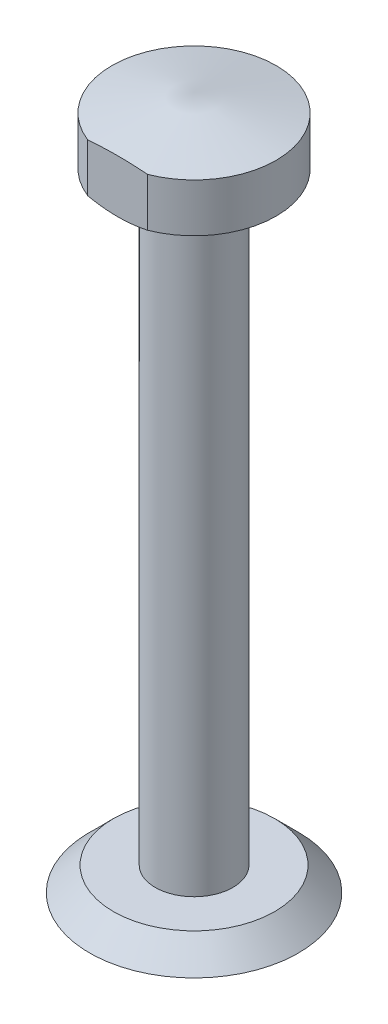
ISO-10303-21;
HEADER;
FILE_DESCRIPTION(('STEP AP214'),'2;1');
FILE_NAME('part.step','',(''),(''),'','','');
FILE_SCHEMA(('AUTOMOTIVE_DESIGN { 1 0 10303 214 1 1 1 1 }'));
ENDSEC;
DATA;
#1=APPLICATION_CONTEXT('core data for automotive mechanical design processes');
#2=APPLICATION_PROTOCOL_DEFINITION('international standard','automotive_design',2000,#1);
#3=PRODUCT_CONTEXT('',#1,'mechanical');
#4=PRODUCT('Part','Part','',(#3));
#5=PRODUCT_RELATED_PRODUCT_CATEGORY('part','',(#4));
#6=PRODUCT_DEFINITION_FORMATION('','',#4);
#7=PRODUCT_DEFINITION_CONTEXT('part definition',#1,'design');
#8=PRODUCT_DEFINITION('design','',#6,#7);
#9=PRODUCT_DEFINITION_SHAPE('','',#8);
#10=(LENGTH_UNIT() NAMED_UNIT(*) SI_UNIT(.MILLI.,.METRE.));
#11=(NAMED_UNIT(*) PLANE_ANGLE_UNIT() SI_UNIT($,.RADIAN.));
#12=(NAMED_UNIT(*) SI_UNIT($,.STERADIAN.) SOLID_ANGLE_UNIT());
#13=UNCERTAINTY_MEASURE_WITH_UNIT(LENGTH_MEASURE(1.E-05),#10,'distance_accuracy_value','');
#14=(GEOMETRIC_REPRESENTATION_CONTEXT(3) GLOBAL_UNCERTAINTY_ASSIGNED_CONTEXT((#13)) GLOBAL_UNIT_ASSIGNED_CONTEXT((#10,
#11,#12)) REPRESENTATION_CONTEXT('',''));
#15=CARTESIAN_POINT('',(0.,0.,0.));
#16=DIRECTION('',(0.,0.,1.));
#17=DIRECTION('',(1.,0.,0.));
#18=AXIS2_PLACEMENT_3D('',#15,#16,#17);
#19=CARTESIAN_POINT('',(1.27,0.,3.25340686819215));
#20=DIRECTION('',(0.,0.,-1.));
#21=DIRECTION('',(-1.,0.,0.));
#22=AXIS2_PLACEMENT_3D('',#19,#20,#21);
#23=PLANE('',#22);
#24=CARTESIAN_POINT('',(-4.89882967706772,2.16426954046307,3.25340686819215));
#25=CARTESIAN_POINT('',(-4.7519167099686,2.1909643249345,3.25340686819215));
#26=CARTESIAN_POINT('',(-4.60494045734861,2.21731638959515,3.25340686819215));
#27=CARTESIAN_POINT('',(-4.31083071006533,2.26915356575494,3.25340686819215));
#28=CARTESIAN_POINT('',(-4.16369721074294,2.2946386507878,3.25340686819215));
#29=CARTESIAN_POINT('',(-3.86914996000027,2.34457587740771,3.25340686819215));
#30=CARTESIAN_POINT('',(-3.72173608540707,2.36902729620814,3.25340686819215));
#31=CARTESIAN_POINT('',(-3.42669963324869,2.41662931044595,3.25340686819215));
#32=CARTESIAN_POINT('',(-3.27907705694821,2.43977991373171,3.25340686819215));
#33=CARTESIAN_POINT('',(-2.83747630753173,2.50660654161038,3.25340686819215));
#34=CARTESIAN_POINT('',(-2.5431362347157,2.54793967043783,3.25340686819215));
#35=CARTESIAN_POINT('',(-1.95326037521305,2.6210895173789,3.25340686819215));
#36=CARTESIAN_POINT('',(-1.65772476156763,2.65290756602949,3.25340686819215));
#37=CARTESIAN_POINT('',(-1.21246256748333,2.69041024332625,3.25340686819215));
#38=CARTESIAN_POINT('',(-1.06316946941012,2.70122751819436,3.25340686819215));
#39=CARTESIAN_POINT('',(-0.764350039500438,2.71885576342233,3.25340686819215));
#40=CARTESIAN_POINT('',(-0.614823720782832,2.72566695151872,3.25340686819215));
#41=CARTESIAN_POINT('',(-0.315670450385112,2.73490538670405,3.25340686819215));
#42=CARTESIAN_POINT('',(-0.16604353290255,2.73733372169666,3.25340686819215));
#43=CARTESIAN_POINT('',(0.133215448923475,2.73766310304199,3.25340686819215));
#44=CARTESIAN_POINT('',(0.282847513269546,2.73556414706589,3.25340686819215));
#45=CARTESIAN_POINT('',(0.582365533255247,2.72695508890956,3.25340686819215));
#46=CARTESIAN_POINT('',(0.732251159353576,2.72043371762748,3.25340686819215));
#47=CARTESIAN_POINT('',(1.03179396271561,2.70333388919217,3.25340686819215));
#48=CARTESIAN_POINT('',(1.18145112693377,2.69275520846436,3.25340686819215));
#49=CARTESIAN_POINT('',(1.63008058208111,2.65569636163098,3.25340686819215));
#50=CARTESIAN_POINT('',(1.92861268722816,2.6238968322093,3.25340686819215));
#51=CARTESIAN_POINT('',(2.51952796820642,2.55109613340072,3.25340686819215));
#52=CARTESIAN_POINT('',(2.81193178096016,2.51025417667557,3.25340686819215));
#53=CARTESIAN_POINT('',(3.39581238317383,2.42231202644766,3.25340686819215));
#54=CARTESIAN_POINT('',(3.68728907935283,2.37521122241516,3.25340686819215));
#55=CARTESIAN_POINT('',(4.26959140133661,2.27685835974507,3.25340686819215));
#56=CARTESIAN_POINT('',(4.56041688640625,2.22560547887022,3.25340686819215));
#57=CARTESIAN_POINT('',(5.14156147333174,2.12029761523514,3.25340686819215));
#58=CARTESIAN_POINT('',(5.43188056761253,2.06624259092322,3.25340686819215));
#59=CARTESIAN_POINT('',(6.00999849172882,1.95659096656105,3.25340686819215));
#60=CARTESIAN_POINT('',(6.29780006184337,1.90100874976937,3.25340686819215));
#61=CARTESIAN_POINT('',(6.87313668159848,1.78846412798365,3.25340686819215));
#62=CARTESIAN_POINT('',(7.16067172749545,1.73150170389937,3.25340686819215));
#63=CARTESIAN_POINT('',(7.73527000366069,1.6166181988133,3.25340686819215));
#64=CARTESIAN_POINT('',(8.02233342365946,1.55869806470801,3.25340686819215));
#65=CARTESIAN_POINT('',(8.5962956157036,1.44208185724197,3.25340686819215));
#66=CARTESIAN_POINT('',(8.8831943915008,1.3833858023598,3.25340686819215));
#67=CARTESIAN_POINT('',(9.17003658488438,1.32441770074967,3.25340686819215));
#68=B_SPLINE_CURVE_WITH_KNOTS('',3,(#24,#25,#26,#27,#28,#29,#30,#31,#32,#33,#34,#35,#36,#37,#38,
#39,#40,#41,#42,#43,#44,#45,#46,#47,#48,#49,#50,#51,#52,#53,#54,#55,#56,#57,#58,#59,#60,#61,#62,
#63,#64,#65,#66,#67),.UNSPECIFIED.,.F.,.F.,(4,2,2,2,2,2,2,2,2,2,2,2,2,2,2,2,2,2,2,2,2,4),(0.,
0.447956687269475,0.895927037059361,1.34420561490563,1.79248148780424,2.68407463007321,
3.5755430384531,4.02455127842692,4.47353511190559,4.92240748411371,5.3712800872202,
5.82130081709647,6.27134634854511,7.17173169563352,8.05737243613143,8.94309963144319,
9.82900265841436,10.7149188257964,11.5942733331645,12.4736400102154,13.3521838567276,
14.2307068182374),.UNSPECIFIED.);
#69=CARTESIAN_POINT('',(-1.27000000000001,2.68534167212368,3.25340686819215));
#70=VERTEX_POINT('',#69);
#71=CARTESIAN_POINT('',(1.27000000000001,2.68534167212368,3.25340686819215));
#72=VERTEX_POINT('',#71);
#73=EDGE_CURVE('E11',#70,#72,#68,.T.);
#74=ORIENTED_EDGE('',*,*,#73,.F.);
#75=DIRECTION('',(0.,1.,0.));
#76=VECTOR('',#75,1.);
#77=CARTESIAN_POINT('',(-1.27000000000001,0.,3.25340686819215));
#78=LINE('',#77,#76);
#79=CARTESIAN_POINT('',(-1.27000000000001,0.62794167212368,3.25340686819215));
#80=VERTEX_POINT('',#79);
#81=EDGE_CURVE('E76',#80,#70,#78,.T.);
#82=ORIENTED_EDGE('',*,*,#81,.F.);
#83=CARTESIAN_POINT('',(1.27000000000001,0.627941672123679,3.25340686819215));
#84=CARTESIAN_POINT('',(1.19185442410433,0.611531398834376,3.25340686819215));
#85=CARTESIAN_POINT('',(1.11343527376145,0.596385289302159,3.25340686819215));
#86=CARTESIAN_POINT('',(0.956094642560905,0.568853854683344,3.25340686819215));
#87=CARTESIAN_POINT('',(0.877173039336211,0.556469230821725,3.25340686819215));
#88=CARTESIAN_POINT('',(0.718865878140397,0.53469544117384,3.25340686819215));
#89=CARTESIAN_POINT('',(0.639480076427389,0.525308026603405,3.25340686819215));
#90=CARTESIAN_POINT('',(0.480406175495382,0.5097285199006,3.25340686819215));
#91=CARTESIAN_POINT('',(0.400718104909803,0.503536132365295,3.25340686819215));
#92=CARTESIAN_POINT('',(0.164002693533581,0.490131479381196,3.25340686819215));
#93=CARTESIAN_POINT('',(0.0066737311917493,0.487719145714795,3.25340686819215));
#94=CARTESIAN_POINT('',(-0.307527045773426,0.496096688800075,3.25340686819215));
#95=CARTESIAN_POINT('',(-0.464399084913551,0.506878302128714,3.25340686819215));
#96=CARTESIAN_POINT('',(-0.674920259314537,0.52964389436787,3.25340686819215));
#97=CARTESIAN_POINT('',(-0.72919709335022,0.536262626688352,3.25340686819215));
#98=CARTESIAN_POINT('',(-0.837557473565171,0.550909179244308,3.25340686819215));
#99=CARTESIAN_POINT('',(-0.891641038969577,0.558936855107428,3.25340686819215));
#100=CARTESIAN_POINT('',(-0.999910953022572,0.576383287192539,3.25340686819215));
#101=CARTESIAN_POINT('',(-1.05409600746065,0.58581001473057,3.25340686819215));
#102=CARTESIAN_POINT('',(-1.16222974465088,0.605939106093779,3.25340686819215));
#103=CARTESIAN_POINT('',(-1.21617842407049,0.616641487844234,3.25340686819215));
#104=CARTESIAN_POINT('',(-1.27000000000001,0.62794167212368,3.25340686819215));
#105=B_SPLINE_CURVE_WITH_KNOTS('',3,(#83,#84,#85,#86,#87,#88,#89,#90,#91,#92,#93,#94,#95,#96,
#97,#98,#99,#100,#101,#102,#103,#104),.UNSPECIFIED.,.F.,.F.,(4,2,2,2,2,2,2,2,2,2,4),(0.,
0.239551176665022,0.479163113541633,0.718914796270867,0.95864430828079,1.43009859386578,
1.90125775675973,2.0652829796504,2.22929140492222,2.39427296994243,2.55925685352912),.UNSPECIFIED.);
#106=CARTESIAN_POINT('',(1.27,0.627941672123678,3.25340686819215));
#107=VERTEX_POINT('',#106);
#108=EDGE_CURVE('E100',#107,#80,#105,.T.);
#109=ORIENTED_EDGE('',*,*,#108,.F.);
#110=DIRECTION('',(0.,1.,0.));
#111=VECTOR('',#110,1.);
#112=CARTESIAN_POINT('',(1.27,0.,3.25340686819215));
#113=LINE('',#112,#111);
#114=EDGE_CURVE('E65',#72,#107,#113,.F.);
#115=ORIENTED_EDGE('',*,*,#114,.F.);
#116=EDGE_LOOP('',(#74,#82,#109,#115));
#117=FACE_BOUND('',#116,.T.);
#118=ADVANCED_FACE('F43',(#117),#23,.F.);
#119=CARTESIAN_POINT('',(0.,-26.035,0.));
#120=DIRECTION('',(0.,-1.,0.));
#121=DIRECTION('',(0.,0.,-1.));
#122=AXIS2_PLACEMENT_3D('',#119,#120,#121);
#123=PLANE('',#122);
#124=CARTESIAN_POINT('',(0.,-26.035,0.));
#125=DIRECTION('',(0.,-1.,0.));
#126=DIRECTION('',(0.,0.,-1.));
#127=AXIS2_PLACEMENT_3D('',#124,#125,#126);
#128=CIRCLE('',#127,4.445);
#129=CARTESIAN_POINT('',(0.,-26.035,-4.445));
#130=VERTEX_POINT('',#129);
#131=EDGE_CURVE('E97',#130,#130,#128,.F.);
#132=ORIENTED_EDGE('',*,*,#131,.F.);
#133=EDGE_LOOP('',(#132));
#134=FACE_BOUND('',#133,.T.);
#135=ADVANCED_FACE('F45',(#134),#123,.T.);
#136=CARTESIAN_POINT('',(0.,4.6355,0.));
#137=DIRECTION('',(0.,-1.,0.));
#138=DIRECTION('',(0.,0.,-1.));
#139=AXIS2_PLACEMENT_3D('',#136,#137,#138);
#140=CYLINDRICAL_SURFACE('',#139,3.49249999999998);
#141=ORIENTED_EDGE('',*,*,#81,.T.);
#142=CARTESIAN_POINT('',(0.,2.68534167212368,0.));
#143=DIRECTION('',(0.,1.,0.));
#144=DIRECTION('',(0.,0.,1.));
#145=AXIS2_PLACEMENT_3D('',#142,#143,#144);
#146=CIRCLE('',#145,3.49249999999998);
#147=EDGE_CURVE('E80',#72,#70,#146,.T.);
#148=ORIENTED_EDGE('',*,*,#147,.F.);
#149=ORIENTED_EDGE('',*,*,#114,.T.);
#150=CARTESIAN_POINT('',(0.,0.62794167212368,0.));
#151=DIRECTION('',(0.,1.,0.));
#152=DIRECTION('',(-1.,0.,0.));
#153=AXIS2_PLACEMENT_3D('',#150,#151,#152);
#154=CIRCLE('',#153,3.49249999999998);
#155=EDGE_CURVE('E82',#80,#107,#154,.F.);
#156=ORIENTED_EDGE('',*,*,#155,.F.);
#157=EDGE_LOOP('',(#141,#148,#149,#156));
#158=FACE_BOUND('',#157,.T.);
#159=ADVANCED_FACE('F78',(#158),#140,.T.);
#160=CARTESIAN_POINT('',(0.,-26.035,0.));
#161=DIRECTION('',(0.,-1.,0.));
#162=DIRECTION('',(0.,0.,-1.));
#163=AXIS2_PLACEMENT_3D('',#160,#161,#162);
#164=CONICAL_SURFACE('',#163,4.44499999999999,0.785398163397448);
#165=ORIENTED_EDGE('',*,*,#131,.T.);
#166=EDGE_LOOP('',(#165));
#167=FACE_BOUND('',#166,.T.);
#168=CARTESIAN_POINT('',(0.,-25.019,0.));
#169=DIRECTION('',(0.,-1.,0.));
#170=DIRECTION('',(0.,0.,-1.));
#171=AXIS2_PLACEMENT_3D('',#168,#169,#170);
#172=CIRCLE('',#171,3.429);
#173=CARTESIAN_POINT('',(0.,-25.019,-3.429));
#174=VERTEX_POINT('',#173);
#175=EDGE_CURVE('E108',#174,#174,#172,.T.);
#176=ORIENTED_EDGE('',*,*,#175,.T.);
#177=EDGE_LOOP('',(#176));
#178=FACE_BOUND('',#177,.T.);
#179=ADVANCED_FACE('F117',(#167,#178),#164,.T.);
#180=CARTESIAN_POINT('',(0.,0.62794167212368,0.));
#181=DIRECTION('',(0.,1.,0.));
#182=DIRECTION('',(0.,0.,1.));
#183=AXIS2_PLACEMENT_3D('',#180,#181,#182);
#184=CONICAL_SURFACE('',#183,3.49249999999998,1.0471975511966);
#185=CARTESIAN_POINT('',(0.,-0.435248848589012,0.));
#186=DIRECTION('',(0.,-1.,0.));
#187=DIRECTION('',(0.,0.,-1.));
#188=AXIS2_PLACEMENT_3D('',#185,#186,#187);
#189=CIRCLE('',#188,1.651);
#190=CARTESIAN_POINT('',(0.,-0.435248848589012,-1.651));
#191=VERTEX_POINT('',#190);
#192=EDGE_CURVE('E151',#191,#191,#189,.T.);
#193=ORIENTED_EDGE('',*,*,#192,.F.);
#194=EDGE_LOOP('',(#193));
#195=FACE_BOUND('',#194,.T.);
#196=ORIENTED_EDGE('',*,*,#155,.T.);
#197=ORIENTED_EDGE('',*,*,#108,.T.);
#198=EDGE_LOOP('',(#196,#197));
#199=FACE_BOUND('',#198,.T.);
#200=ADVANCED_FACE('F112',(#195,#199),#184,.T.);
#201=CARTESIAN_POINT('',(0.,-25.019,0.));
#202=DIRECTION('',(0.,-1.,0.));
#203=DIRECTION('',(0.,0.,-1.));
#204=AXIS2_PLACEMENT_3D('',#201,#202,#203);
#205=PLANE('',#204);
#206=CARTESIAN_POINT('',(0.,-25.019,0.));
#207=DIRECTION('',(0.,-1.,0.));
#208=DIRECTION('',(0.,0.,-1.));
#209=AXIS2_PLACEMENT_3D('',#206,#207,#208);
#210=CIRCLE('',#209,1.651);
#211=CARTESIAN_POINT('',(0.,-25.019,-1.651));
#212=VERTEX_POINT('',#211);
#213=EDGE_CURVE('E59',#212,#212,#210,.F.);
#214=ORIENTED_EDGE('',*,*,#213,.F.);
#215=EDGE_LOOP('',(#214));
#216=FACE_BOUND('',#215,.T.);
#217=ORIENTED_EDGE('',*,*,#175,.F.);
#218=EDGE_LOOP('',(#217));
#219=FACE_BOUND('',#218,.T.);
#220=ADVANCED_FACE('F116',(#216,#219),#205,.F.);
#221=CARTESIAN_POINT('',(0.,4.6355,0.));
#222=DIRECTION('',(0.,-1.,0.));
#223=DIRECTION('',(0.,0.,-1.));
#224=AXIS2_PLACEMENT_3D('',#221,#222,#223);
#225=CYLINDRICAL_SURFACE('',#224,1.651);
#226=ORIENTED_EDGE('',*,*,#213,.T.);
#227=EDGE_LOOP('',(#226));
#228=FACE_BOUND('',#227,.T.);
#229=ORIENTED_EDGE('',*,*,#192,.T.);
#230=EDGE_LOOP('',(#229));
#231=FACE_BOUND('',#230,.T.);
#232=ADVANCED_FACE('F130',(#228,#231),#225,.T.);
#233=CARTESIAN_POINT('',(0.,2.68534167212368,0.));
#234=DIRECTION('',(0.,-1.,0.));
#235=DIRECTION('',(0.,0.,-1.));
#236=AXIS2_PLACEMENT_3D('',#233,#234,#235);
#237=CONICAL_SURFACE('',#236,3.49249999999998,1.35598092639324);
#238=CARTESIAN_POINT('',(0.,3.44734167212368,0.));
#239=VERTEX_POINT('',#238);
#240=VERTEX_LOOP('',#239);
#241=FACE_BOUND('',#240,.T.);
#242=ORIENTED_EDGE('',*,*,#147,.T.);
#243=ORIENTED_EDGE('',*,*,#73,.T.);
#244=EDGE_LOOP('',(#242,#243));
#245=FACE_BOUND('',#244,.T.);
#246=ADVANCED_FACE('F87',(#241,#245),#237,.T.);
#247=CLOSED_SHELL('',(#118,#135,#159,#179,#200,#220,#232,#246));
#248=MANIFOLD_SOLID_BREP('B2',#247);
#249=ADVANCED_BREP_SHAPE_REPRESENTATION('',(#18,#248),#14);
#250=SHAPE_DEFINITION_REPRESENTATION(#9,#249);
ENDSEC;
END-ISO-10303-21;
